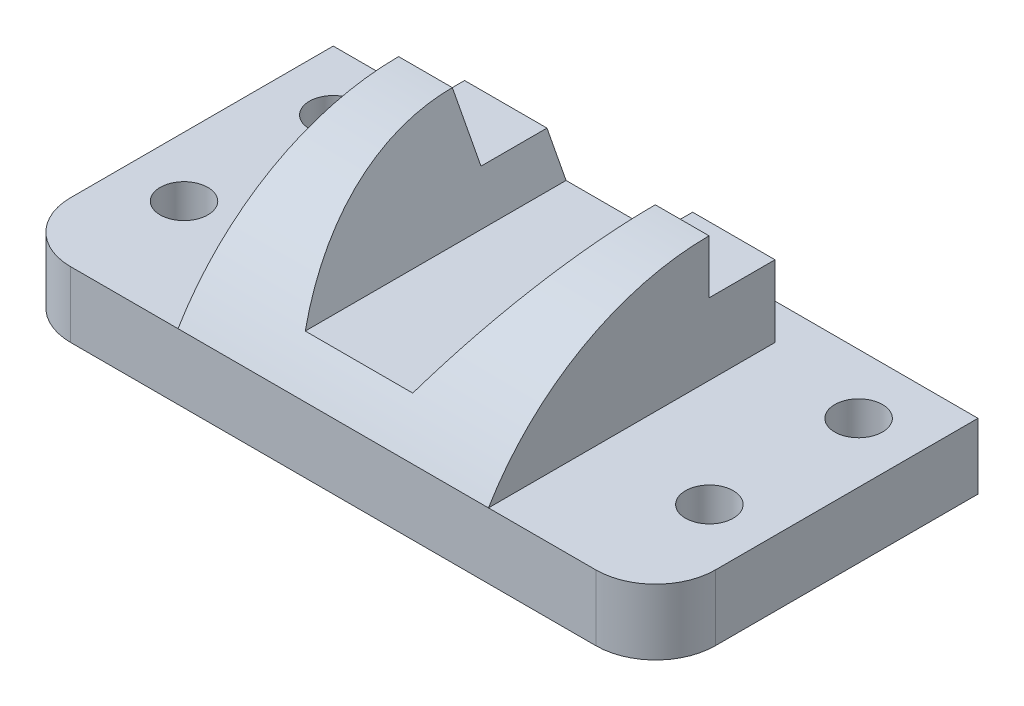
ISO-10303-21;
HEADER;
FILE_DESCRIPTION(('STEP AP214'),'2;1');
FILE_NAME('part.step','',(''),(''),'','','');
FILE_SCHEMA(('AUTOMOTIVE_DESIGN { 1 0 10303 214 1 1 1 1 }'));
ENDSEC;
DATA;
#1=APPLICATION_CONTEXT('core data for automotive mechanical design processes');
#2=APPLICATION_PROTOCOL_DEFINITION('international standard','automotive_design',2000,#1);
#3=PRODUCT_CONTEXT('',#1,'mechanical');
#4=PRODUCT('Part','Part','',(#3));
#5=PRODUCT_RELATED_PRODUCT_CATEGORY('part','',(#4));
#6=PRODUCT_DEFINITION_FORMATION('','',#4);
#7=PRODUCT_DEFINITION_CONTEXT('part definition',#1,'design');
#8=PRODUCT_DEFINITION('design','',#6,#7);
#9=PRODUCT_DEFINITION_SHAPE('','',#8);
#10=(LENGTH_UNIT() NAMED_UNIT(*) SI_UNIT(.MILLI.,.METRE.));
#11=(NAMED_UNIT(*) PLANE_ANGLE_UNIT() SI_UNIT($,.RADIAN.));
#12=(NAMED_UNIT(*) SI_UNIT($,.STERADIAN.) SOLID_ANGLE_UNIT());
#13=UNCERTAINTY_MEASURE_WITH_UNIT(LENGTH_MEASURE(1.E-05),#10,'distance_accuracy_value','');
#14=(GEOMETRIC_REPRESENTATION_CONTEXT(3) GLOBAL_UNCERTAINTY_ASSIGNED_CONTEXT((#13)) GLOBAL_UNIT_ASSIGNED_CONTEXT((#10,
#11,#12)) REPRESENTATION_CONTEXT('',''));
#15=CARTESIAN_POINT('',(0.,0.,0.));
#16=DIRECTION('',(0.,0.,1.));
#17=DIRECTION('',(1.,0.,0.));
#18=AXIS2_PLACEMENT_3D('',#15,#16,#17);
#19=CARTESIAN_POINT('',(26.,23.,-21.));
#20=DIRECTION('',(0.,0.,1.));
#21=DIRECTION('',(0.,-1.,0.));
#22=AXIS2_PLACEMENT_3D('',#19,#20,#21);
#23=PLANE('',#22);
#24=DIRECTION('',(-0.470588235294117,-0.882352941176471,0.));
#25=VECTOR('',#24,1.);
#26=CARTESIAN_POINT('',(-0.0519031141868437,0.0276816608996517,-21.));
#27=LINE('',#26,#25);
#28=CARTESIAN_POINT('',(12.2,23.,-21.));
#29=VERTEX_POINT('',#28);
#30=CARTESIAN_POINT('',(9.,17.,-21.));
#31=VERTEX_POINT('',#30);
#32=EDGE_CURVE('E341',#29,#31,#27,.T.);
#33=ORIENTED_EDGE('',*,*,#32,.F.);
#34=DIRECTION('',(-1.,0.,0.));
#35=VECTOR('',#34,1.);
#36=CARTESIAN_POINT('',(26.,23.,-21.));
#37=LINE('',#36,#35);
#38=CARTESIAN_POINT('',(26.,23.,-21.));
#39=VERTEX_POINT('',#38);
#40=EDGE_CURVE('E194',#39,#29,#37,.T.);
#41=ORIENTED_EDGE('',*,*,#40,.F.);
#42=DIRECTION('',(0.,1.,0.));
#43=VECTOR('',#42,1.);
#44=CARTESIAN_POINT('',(26.,23.,-21.));
#45=LINE('',#44,#43);
#46=CARTESIAN_POINT('',(26.,11.,-21.));
#47=VERTEX_POINT('',#46);
#48=EDGE_CURVE('E291',#47,#39,#45,.T.);
#49=ORIENTED_EDGE('',*,*,#48,.F.);
#50=DIRECTION('',(-1.,0.,0.));
#51=VECTOR('',#50,1.);
#52=CARTESIAN_POINT('',(26.,11.,-21.));
#53=LINE('',#52,#51);
#54=CARTESIAN_POINT('',(-26.,11.,-21.));
#55=VERTEX_POINT('',#54);
#56=EDGE_CURVE('E197',#47,#55,#53,.T.);
#57=ORIENTED_EDGE('',*,*,#56,.T.);
#58=DIRECTION('',(0.,1.,0.));
#59=VECTOR('',#58,1.);
#60=CARTESIAN_POINT('',(-26.,23.,-21.));
#61=LINE('',#60,#59);
#62=CARTESIAN_POINT('',(-26.,23.,-21.));
#63=VERTEX_POINT('',#62);
#64=EDGE_CURVE('E306',#55,#63,#61,.T.);
#65=ORIENTED_EDGE('',*,*,#64,.T.);
#66=CARTESIAN_POINT('',(-12.2,23.,-21.));
#67=VERTEX_POINT('',#66);
#68=EDGE_CURVE('E193',#67,#63,#37,.T.);
#69=ORIENTED_EDGE('',*,*,#68,.F.);
#70=DIRECTION('',(0.470588235294117,-0.882352941176471,0.));
#71=VECTOR('',#70,1.);
#72=CARTESIAN_POINT('',(0.0519031141868437,0.0276816608996517,-21.));
#73=LINE('',#72,#71);
#74=CARTESIAN_POINT('',(-9.,17.,-21.));
#75=VERTEX_POINT('',#74);
#76=EDGE_CURVE('E327',#67,#75,#73,.T.);
#77=ORIENTED_EDGE('',*,*,#76,.T.);
#78=DIRECTION('',(-1.,0.,0.));
#79=VECTOR('',#78,1.);
#80=CARTESIAN_POINT('',(0.,17.,-21.));
#81=LINE('',#80,#79);
#82=EDGE_CURVE('E342',#31,#75,#81,.T.);
#83=ORIENTED_EDGE('',*,*,#82,.F.);
#84=EDGE_LOOP('',(#33,#41,#49,#57,#65,#69,#77,#83));
#85=FACE_BOUND('',#84,.T.);
#86=ADVANCED_FACE('F39',(#85),#23,.F.);
#87=CARTESIAN_POINT('',(26.,23.,-9.94590640382233));
#88=DIRECTION('',(0.,-1.,0.));
#89=DIRECTION('',(0.,0.,-1.));
#90=AXIS2_PLACEMENT_3D('',#87,#88,#89);
#91=PLANE('',#90);
#92=DIRECTION('',(0.,0.,-1.));
#93=VECTOR('',#92,1.);
#94=CARTESIAN_POINT('',(12.2,23.,-27.001));
#95=LINE('',#94,#93);
#96=CARTESIAN_POINT('',(12.2,23.,-9.94590640382233));
#97=VERTEX_POINT('',#96);
#98=EDGE_CURVE('E180',#97,#29,#95,.T.);
#99=ORIENTED_EDGE('',*,*,#98,.F.);
#100=DIRECTION('',(-1.,0.,0.));
#101=VECTOR('',#100,1.);
#102=CARTESIAN_POINT('',(26.,23.,-9.94590640382233));
#103=LINE('',#102,#101);
#104=CARTESIAN_POINT('',(26.,23.,-9.94590640382233));
#105=VERTEX_POINT('',#104);
#106=EDGE_CURVE('E177',#105,#97,#103,.T.);
#107=ORIENTED_EDGE('',*,*,#106,.F.);
#108=DIRECTION('',(0.,0.,1.));
#109=VECTOR('',#108,1.);
#110=CARTESIAN_POINT('',(26.,23.,-9.94590640382233));
#111=LINE('',#110,#109);
#112=EDGE_CURVE('E293',#39,#105,#111,.T.);
#113=ORIENTED_EDGE('',*,*,#112,.F.);
#114=ORIENTED_EDGE('',*,*,#40,.T.);
#115=EDGE_LOOP('',(#99,#107,#113,#114));
#116=FACE_BOUND('',#115,.T.);
#117=ADVANCED_FACE('F354',(#116),#91,.F.);
#118=CARTESIAN_POINT('',(26.,32.,-9.94590640382233));
#119=DIRECTION('',(0.,0.,1.));
#120=DIRECTION('',(0.,-1.,0.));
#121=AXIS2_PLACEMENT_3D('',#118,#119,#120);
#122=PLANE('',#121);
#123=DIRECTION('',(-0.470588235294117,-0.882352941176471,0.));
#124=VECTOR('',#123,1.);
#125=CARTESIAN_POINT('',(-0.0519031141868458,0.0276816608996478,-9.94590640382234));
#126=LINE('',#125,#124);
#127=CARTESIAN_POINT('',(17.,32.,-9.94590640382234));
#128=VERTEX_POINT('',#127);
#129=EDGE_CURVE('E158',#128,#97,#126,.T.);
#130=ORIENTED_EDGE('',*,*,#129,.F.);
#131=DIRECTION('',(-1.,0.,0.));
#132=VECTOR('',#131,1.);
#133=CARTESIAN_POINT('',(26.,32.,-9.94590640382233));
#134=LINE('',#133,#132);
#135=CARTESIAN_POINT('',(26.,32.,-9.94590640382233));
#136=VERTEX_POINT('',#135);
#137=EDGE_CURVE('E172',#136,#128,#134,.T.);
#138=ORIENTED_EDGE('',*,*,#137,.F.);
#139=DIRECTION('',(0.,1.,0.));
#140=VECTOR('',#139,1.);
#141=CARTESIAN_POINT('',(26.,32.,-9.94590640382233));
#142=LINE('',#141,#140);
#143=EDGE_CURVE('E187',#105,#136,#142,.T.);
#144=ORIENTED_EDGE('',*,*,#143,.F.);
#145=ORIENTED_EDGE('',*,*,#106,.T.);
#146=EDGE_LOOP('',(#130,#138,#144,#145));
#147=FACE_BOUND('',#146,.T.);
#148=ADVANCED_FACE('F171',(#147),#122,.F.);
#149=CARTESIAN_POINT('',(0.,11.,0.));
#150=DIRECTION('',(0.,1.,0.));
#151=DIRECTION('',(0.,0.,1.));
#152=AXIS2_PLACEMENT_3D('',#149,#150,#151);
#153=PLANE('',#152);
#154=CARTESIAN_POINT('',(-44.,11.,-17.));
#155=DIRECTION('',(0.,1.,0.));
#156=DIRECTION('',(0.,0.,1.));
#157=AXIS2_PLACEMENT_3D('',#154,#155,#156);
#158=CIRCLE('',#157,4.00000000000001);
#159=CARTESIAN_POINT('',(-44.,11.,-13.));
#160=VERTEX_POINT('',#159);
#161=EDGE_CURVE('E209',#160,#160,#158,.T.);
#162=ORIENTED_EDGE('',*,*,#161,.F.);
#163=EDGE_LOOP('',(#162));
#164=FACE_BOUND('',#163,.T.);
#165=CARTESIAN_POINT('',(44.,11.,-17.));
#166=DIRECTION('',(0.,1.,0.));
#167=DIRECTION('',(0.,0.,-1.));
#168=AXIS2_PLACEMENT_3D('',#165,#166,#167);
#169=CIRCLE('',#168,4.00000000000001);
#170=CARTESIAN_POINT('',(44.,11.,-21.));
#171=VERTEX_POINT('',#170);
#172=EDGE_CURVE('E225',#171,#171,#169,.T.);
#173=ORIENTED_EDGE('',*,*,#172,.F.);
#174=EDGE_LOOP('',(#173));
#175=FACE_BOUND('',#174,.T.);
#176=CARTESIAN_POINT('',(-44.,11.,8.00000000000001));
#177=DIRECTION('',(0.,1.,0.));
#178=DIRECTION('',(0.,0.,1.));
#179=AXIS2_PLACEMENT_3D('',#176,#177,#178);
#180=CIRCLE('',#179,4.00000000000001);
#181=CARTESIAN_POINT('',(-44.,11.,12.));
#182=VERTEX_POINT('',#181);
#183=EDGE_CURVE('E216',#182,#182,#180,.T.);
#184=ORIENTED_EDGE('',*,*,#183,.F.);
#185=EDGE_LOOP('',(#184));
#186=FACE_BOUND('',#185,.T.);
#187=CARTESIAN_POINT('',(44.,11.,8.00000000000001));
#188=DIRECTION('',(0.,1.,0.));
#189=DIRECTION('',(0.,0.,-1.));
#190=AXIS2_PLACEMENT_3D('',#187,#188,#189);
#191=CIRCLE('',#190,4.00000000000001);
#192=CARTESIAN_POINT('',(44.,11.,4.));
#193=VERTEX_POINT('',#192);
#194=EDGE_CURVE('E204',#193,#193,#191,.T.);
#195=ORIENTED_EDGE('',*,*,#194,.F.);
#196=EDGE_LOOP('',(#195));
#197=FACE_BOUND('',#196,.T.);
#198=DIRECTION('',(0.,0.,1.));
#199=VECTOR('',#198,1.);
#200=CARTESIAN_POINT('',(-54.,11.,27.));
#201=LINE('',#200,#199);
#202=CARTESIAN_POINT('',(-54.,11.,-27.));
#203=VERTEX_POINT('',#202);
#204=CARTESIAN_POINT('',(-54.,11.,17.));
#205=VERTEX_POINT('',#204);
#206=EDGE_CURVE('E227',#203,#205,#201,.T.);
#207=ORIENTED_EDGE('',*,*,#206,.T.);
#208=CARTESIAN_POINT('',(-44.,11.,17.));
#209=DIRECTION('',(0.,1.,0.));
#210=DIRECTION('',(0.,0.,1.));
#211=AXIS2_PLACEMENT_3D('',#208,#209,#210);
#212=CIRCLE('',#211,10.);
#213=CARTESIAN_POINT('',(-44.,11.,27.));
#214=VERTEX_POINT('',#213);
#215=EDGE_CURVE('E50',#205,#214,#212,.T.);
#216=ORIENTED_EDGE('',*,*,#215,.T.);
#217=DIRECTION('',(1.,0.,0.));
#218=VECTOR('',#217,1.);
#219=CARTESIAN_POINT('',(54.,11.,27.));
#220=LINE('',#219,#218);
#221=CARTESIAN_POINT('',(-26.,11.,27.));
#222=VERTEX_POINT('',#221);
#223=EDGE_CURVE('E235',#214,#222,#220,.T.);
#224=ORIENTED_EDGE('',*,*,#223,.T.);
#225=DIRECTION('',(0.,0.,-1.));
#226=VECTOR('',#225,1.);
#227=CARTESIAN_POINT('',(-26.,11.,-21.));
#228=LINE('',#227,#226);
#229=EDGE_CURVE('E301',#222,#55,#228,.T.);
#230=ORIENTED_EDGE('',*,*,#229,.T.);
#231=ORIENTED_EDGE('',*,*,#56,.F.);
#232=DIRECTION('',(0.,0.,-1.));
#233=VECTOR('',#232,1.);
#234=CARTESIAN_POINT('',(26.,11.,-21.));
#235=LINE('',#234,#233);
#236=CARTESIAN_POINT('',(26.,11.,27.));
#237=VERTEX_POINT('',#236);
#238=EDGE_CURVE('E286',#237,#47,#235,.T.);
#239=ORIENTED_EDGE('',*,*,#238,.F.);
#240=CARTESIAN_POINT('',(44.,11.,27.));
#241=VERTEX_POINT('',#240);
#242=EDGE_CURVE('E229',#237,#241,#220,.T.);
#243=ORIENTED_EDGE('',*,*,#242,.T.);
#244=CARTESIAN_POINT('',(44.,11.,17.));
#245=DIRECTION('',(0.,1.,0.));
#246=DIRECTION('',(0.,0.,1.));
#247=AXIS2_PLACEMENT_3D('',#244,#245,#246);
#248=CIRCLE('',#247,10.);
#249=CARTESIAN_POINT('',(54.,11.,17.));
#250=VERTEX_POINT('',#249);
#251=EDGE_CURVE('E53',#241,#250,#248,.T.);
#252=ORIENTED_EDGE('',*,*,#251,.T.);
#253=DIRECTION('',(0.,0.,-1.));
#254=VECTOR('',#253,1.);
#255=CARTESIAN_POINT('',(54.,11.,27.));
#256=LINE('',#255,#254);
#257=CARTESIAN_POINT('',(54.,11.,-27.));
#258=VERTEX_POINT('',#257);
#259=EDGE_CURVE('E234',#250,#258,#256,.T.);
#260=ORIENTED_EDGE('',*,*,#259,.T.);
#261=DIRECTION('',(-1.,0.,0.));
#262=VECTOR('',#261,1.);
#263=CARTESIAN_POINT('',(54.,11.,-27.));
#264=LINE('',#263,#262);
#265=EDGE_CURVE('E237',#258,#203,#264,.T.);
#266=ORIENTED_EDGE('',*,*,#265,.T.);
#267=EDGE_LOOP('',(#207,#216,#224,#230,#231,#239,#243,#252,#260,#266));
#268=FACE_BOUND('',#267,.T.);
#269=ADVANCED_FACE('F263',(#164,#175,#186,#197,#268),#153,.T.);
#270=CARTESIAN_POINT('',(0.,0.,0.));
#271=DIRECTION('',(0.,1.,0.));
#272=DIRECTION('',(0.,0.,1.));
#273=AXIS2_PLACEMENT_3D('',#270,#271,#272);
#274=PLANE('',#273);
#275=DIRECTION('',(1.,0.,0.));
#276=VECTOR('',#275,1.);
#277=CARTESIAN_POINT('',(54.,0.,27.));
#278=LINE('',#277,#276);
#279=CARTESIAN_POINT('',(-44.,0.,27.));
#280=VERTEX_POINT('',#279);
#281=CARTESIAN_POINT('',(44.,0.,27.));
#282=VERTEX_POINT('',#281);
#283=EDGE_CURVE('E238',#280,#282,#278,.T.);
#284=ORIENTED_EDGE('',*,*,#283,.F.);
#285=CARTESIAN_POINT('',(-44.,0.,17.));
#286=DIRECTION('',(0.,1.,0.));
#287=DIRECTION('',(0.,0.,1.));
#288=AXIS2_PLACEMENT_3D('',#285,#286,#287);
#289=CIRCLE('',#288,10.);
#290=CARTESIAN_POINT('',(-54.,0.,17.));
#291=VERTEX_POINT('',#290);
#292=EDGE_CURVE('E256',#280,#291,#289,.F.);
#293=ORIENTED_EDGE('',*,*,#292,.T.);
#294=DIRECTION('',(0.,0.,1.));
#295=VECTOR('',#294,1.);
#296=CARTESIAN_POINT('',(-54.,0.,27.));
#297=LINE('',#296,#295);
#298=CARTESIAN_POINT('',(-54.,0.,-27.));
#299=VERTEX_POINT('',#298);
#300=EDGE_CURVE('E223',#299,#291,#297,.T.);
#301=ORIENTED_EDGE('',*,*,#300,.F.);
#302=DIRECTION('',(-1.,0.,0.));
#303=VECTOR('',#302,1.);
#304=CARTESIAN_POINT('',(54.,0.,-27.));
#305=LINE('',#304,#303);
#306=CARTESIAN_POINT('',(54.,0.,-27.));
#307=VERTEX_POINT('',#306);
#308=EDGE_CURVE('E232',#307,#299,#305,.T.);
#309=ORIENTED_EDGE('',*,*,#308,.F.);
#310=DIRECTION('',(0.,0.,-1.));
#311=VECTOR('',#310,1.);
#312=CARTESIAN_POINT('',(54.,0.,27.));
#313=LINE('',#312,#311);
#314=CARTESIAN_POINT('',(54.,0.,17.));
#315=VERTEX_POINT('',#314);
#316=EDGE_CURVE('E242',#315,#307,#313,.T.);
#317=ORIENTED_EDGE('',*,*,#316,.F.);
#318=CARTESIAN_POINT('',(44.,0.,17.));
#319=DIRECTION('',(0.,1.,0.));
#320=DIRECTION('',(0.,0.,1.));
#321=AXIS2_PLACEMENT_3D('',#318,#319,#320);
#322=CIRCLE('',#321,10.);
#323=EDGE_CURVE('E258',#315,#282,#322,.F.);
#324=ORIENTED_EDGE('',*,*,#323,.T.);
#325=EDGE_LOOP('',(#284,#293,#301,#309,#317,#324));
#326=FACE_BOUND('',#325,.T.);
#327=CARTESIAN_POINT('',(44.,0.,-17.));
#328=DIRECTION('',(0.,1.,0.));
#329=DIRECTION('',(0.,0.,-1.));
#330=AXIS2_PLACEMENT_3D('',#327,#328,#329);
#331=CIRCLE('',#330,4.00000000000001);
#332=CARTESIAN_POINT('',(44.,0.,-21.));
#333=VERTEX_POINT('',#332);
#334=EDGE_CURVE('E218',#333,#333,#331,.T.);
#335=ORIENTED_EDGE('',*,*,#334,.T.);
#336=EDGE_LOOP('',(#335));
#337=FACE_BOUND('',#336,.T.);
#338=CARTESIAN_POINT('',(-44.,0.,8.00000000000001));
#339=DIRECTION('',(0.,1.,0.));
#340=DIRECTION('',(0.,0.,1.));
#341=AXIS2_PLACEMENT_3D('',#338,#339,#340);
#342=CIRCLE('',#341,4.00000000000001);
#343=CARTESIAN_POINT('',(-44.,0.,12.));
#344=VERTEX_POINT('',#343);
#345=EDGE_CURVE('E213',#344,#344,#342,.T.);
#346=ORIENTED_EDGE('',*,*,#345,.T.);
#347=EDGE_LOOP('',(#346));
#348=FACE_BOUND('',#347,.T.);
#349=CARTESIAN_POINT('',(-44.,0.,-17.));
#350=DIRECTION('',(0.,1.,0.));
#351=DIRECTION('',(0.,0.,1.));
#352=AXIS2_PLACEMENT_3D('',#349,#350,#351);
#353=CIRCLE('',#352,4.00000000000001);
#354=CARTESIAN_POINT('',(-44.,0.,-13.));
#355=VERTEX_POINT('',#354);
#356=EDGE_CURVE('E210',#355,#355,#353,.T.);
#357=ORIENTED_EDGE('',*,*,#356,.T.);
#358=EDGE_LOOP('',(#357));
#359=FACE_BOUND('',#358,.T.);
#360=CARTESIAN_POINT('',(44.,0.,8.00000000000001));
#361=DIRECTION('',(0.,1.,0.));
#362=DIRECTION('',(0.,0.,-1.));
#363=AXIS2_PLACEMENT_3D('',#360,#361,#362);
#364=CIRCLE('',#363,4.00000000000001);
#365=CARTESIAN_POINT('',(44.,0.,4.));
#366=VERTEX_POINT('',#365);
#367=EDGE_CURVE('E201',#366,#366,#364,.T.);
#368=ORIENTED_EDGE('',*,*,#367,.T.);
#369=EDGE_LOOP('',(#368));
#370=FACE_BOUND('',#369,.T.);
#371=ADVANCED_FACE('F273',(#326,#337,#348,#359,#370),#274,.F.);
#372=CARTESIAN_POINT('',(-54.,11.,27.));
#373=DIRECTION('',(1.,0.,0.));
#374=DIRECTION('',(0.,0.,-1.));
#375=AXIS2_PLACEMENT_3D('',#372,#373,#374);
#376=PLANE('',#375);
#377=ORIENTED_EDGE('',*,*,#300,.T.);
#378=DIRECTION('',(0.,-1.,0.));
#379=VECTOR('',#378,1.);
#380=CARTESIAN_POINT('',(-54.,11.,17.));
#381=LINE('',#380,#379);
#382=EDGE_CURVE('E65',#291,#205,#381,.F.);
#383=ORIENTED_EDGE('',*,*,#382,.T.);
#384=ORIENTED_EDGE('',*,*,#206,.F.);
#385=DIRECTION('',(0.,-1.,0.));
#386=VECTOR('',#385,1.);
#387=CARTESIAN_POINT('',(-54.,11.,-27.));
#388=LINE('',#387,#386);
#389=EDGE_CURVE('E236',#203,#299,#388,.T.);
#390=ORIENTED_EDGE('',*,*,#389,.T.);
#391=EDGE_LOOP('',(#377,#383,#384,#390));
#392=FACE_BOUND('',#391,.T.);
#393=ADVANCED_FACE('F280',(#392),#376,.F.);
#394=CARTESIAN_POINT('',(54.,11.,27.));
#395=DIRECTION('',(0.,0.,-1.));
#396=DIRECTION('',(-1.,0.,0.));
#397=AXIS2_PLACEMENT_3D('',#394,#395,#396);
#398=PLANE('',#397);
#399=ORIENTED_EDGE('',*,*,#223,.F.);
#400=DIRECTION('',(0.,-1.,0.));
#401=VECTOR('',#400,1.);
#402=CARTESIAN_POINT('',(-44.,11.,27.));
#403=LINE('',#402,#401);
#404=EDGE_CURVE('E251',#214,#280,#403,.T.);
#405=ORIENTED_EDGE('',*,*,#404,.T.);
#406=ORIENTED_EDGE('',*,*,#283,.T.);
#407=DIRECTION('',(0.,-1.,0.));
#408=VECTOR('',#407,1.);
#409=CARTESIAN_POINT('',(44.,11.,27.));
#410=LINE('',#409,#408);
#411=EDGE_CURVE('E253',#282,#241,#410,.F.);
#412=ORIENTED_EDGE('',*,*,#411,.T.);
#413=ORIENTED_EDGE('',*,*,#242,.F.);
#414=DIRECTION('',(-1.,0.,0.));
#415=VECTOR('',#414,1.);
#416=CARTESIAN_POINT('',(26.,11.,27.));
#417=LINE('',#416,#415);
#418=EDGE_CURVE('E199',#237,#222,#417,.T.);
#419=ORIENTED_EDGE('',*,*,#418,.T.);
#420=EDGE_LOOP('',(#399,#405,#406,#412,#413,#419));
#421=FACE_BOUND('',#420,.T.);
#422=ADVANCED_FACE('F270',(#421),#398,.F.);
#423=CARTESIAN_POINT('',(54.,11.,27.));
#424=DIRECTION('',(-1.,0.,0.));
#425=DIRECTION('',(0.,0.,1.));
#426=AXIS2_PLACEMENT_3D('',#423,#424,#425);
#427=PLANE('',#426);
#428=ORIENTED_EDGE('',*,*,#259,.F.);
#429=DIRECTION('',(0.,-1.,0.));
#430=VECTOR('',#429,1.);
#431=CARTESIAN_POINT('',(54.,11.,17.));
#432=LINE('',#431,#430);
#433=EDGE_CURVE('E11',#250,#315,#432,.T.);
#434=ORIENTED_EDGE('',*,*,#433,.T.);
#435=ORIENTED_EDGE('',*,*,#316,.T.);
#436=DIRECTION('',(0.,-1.,0.));
#437=VECTOR('',#436,1.);
#438=CARTESIAN_POINT('',(54.,11.,-27.));
#439=LINE('',#438,#437);
#440=EDGE_CURVE('E248',#258,#307,#439,.T.);
#441=ORIENTED_EDGE('',*,*,#440,.F.);
#442=EDGE_LOOP('',(#428,#434,#435,#441));
#443=FACE_BOUND('',#442,.T.);
#444=ADVANCED_FACE('F284',(#443),#427,.F.);
#445=CARTESIAN_POINT('',(54.,11.,-27.));
#446=DIRECTION('',(0.,0.,1.));
#447=DIRECTION('',(1.,0.,0.));
#448=AXIS2_PLACEMENT_3D('',#445,#446,#447);
#449=PLANE('',#448);
#450=ORIENTED_EDGE('',*,*,#308,.T.);
#451=ORIENTED_EDGE('',*,*,#389,.F.);
#452=ORIENTED_EDGE('',*,*,#265,.F.);
#453=ORIENTED_EDGE('',*,*,#440,.T.);
#454=EDGE_LOOP('',(#450,#451,#452,#453));
#455=FACE_BOUND('',#454,.T.);
#456=ADVANCED_FACE('F281',(#455),#449,.F.);
#457=CARTESIAN_POINT('',(44.,11.,-17.));
#458=DIRECTION('',(0.,-1.,0.));
#459=DIRECTION('',(0.,0.,-1.));
#460=AXIS2_PLACEMENT_3D('',#457,#458,#459);
#461=CYLINDRICAL_SURFACE('',#460,4.00000000000001);
#462=ORIENTED_EDGE('',*,*,#172,.T.);
#463=EDGE_LOOP('',(#462));
#464=FACE_BOUND('',#463,.T.);
#465=ORIENTED_EDGE('',*,*,#334,.F.);
#466=EDGE_LOOP('',(#465));
#467=FACE_BOUND('',#466,.T.);
#468=ADVANCED_FACE('F387',(#464,#467),#461,.F.);
#469=CARTESIAN_POINT('',(-44.,11.,8.00000000000001));
#470=DIRECTION('',(0.,-1.,0.));
#471=DIRECTION('',(0.,0.,-1.));
#472=AXIS2_PLACEMENT_3D('',#469,#470,#471);
#473=CYLINDRICAL_SURFACE('',#472,4.00000000000001);
#474=ORIENTED_EDGE('',*,*,#183,.T.);
#475=EDGE_LOOP('',(#474));
#476=FACE_BOUND('',#475,.T.);
#477=ORIENTED_EDGE('',*,*,#345,.F.);
#478=EDGE_LOOP('',(#477));
#479=FACE_BOUND('',#478,.T.);
#480=ADVANCED_FACE('F385',(#476,#479),#473,.F.);
#481=CARTESIAN_POINT('',(-44.,11.,-17.));
#482=DIRECTION('',(0.,-1.,0.));
#483=DIRECTION('',(0.,0.,-1.));
#484=AXIS2_PLACEMENT_3D('',#481,#482,#483);
#485=CYLINDRICAL_SURFACE('',#484,4.00000000000001);
#486=ORIENTED_EDGE('',*,*,#161,.T.);
#487=EDGE_LOOP('',(#486));
#488=FACE_BOUND('',#487,.T.);
#489=ORIENTED_EDGE('',*,*,#356,.F.);
#490=EDGE_LOOP('',(#489));
#491=FACE_BOUND('',#490,.T.);
#492=ADVANCED_FACE('F378',(#488,#491),#485,.F.);
#493=CARTESIAN_POINT('',(44.,11.,8.00000000000001));
#494=DIRECTION('',(0.,-1.,0.));
#495=DIRECTION('',(0.,0.,-1.));
#496=AXIS2_PLACEMENT_3D('',#493,#494,#495);
#497=CYLINDRICAL_SURFACE('',#496,4.00000000000001);
#498=ORIENTED_EDGE('',*,*,#194,.T.);
#499=EDGE_LOOP('',(#498));
#500=FACE_BOUND('',#499,.T.);
#501=ORIENTED_EDGE('',*,*,#367,.F.);
#502=EDGE_LOOP('',(#501));
#503=FACE_BOUND('',#502,.T.);
#504=ADVANCED_FACE('F376',(#500,#503),#497,.F.);
#505=CARTESIAN_POINT('',(26.,-11.,-9.94590640382234));
#506=DIRECTION('',(-1.,0.,0.));
#507=DIRECTION('',(0.,0.,1.));
#508=AXIS2_PLACEMENT_3D('',#505,#506,#507);
#509=CYLINDRICAL_SURFACE('',#508,43.);
#510=ORIENTED_EDGE('',*,*,#137,.T.);
#511=CARTESIAN_POINT('',(-5.93333333333331,-11.,-9.94590640382234));
#512=DIRECTION('',(-0.882352941176471,0.470588235294117,0.));
#513=DIRECTION('',(-0.470588235294117,-0.882352941176471,0.));
#514=AXIS2_PLACEMENT_3D('',#511,#512,#513);
#515=ELLIPSE('',#514,48.7333333333333,43.);
#516=CARTESIAN_POINT('',(9.,17.,22.6884313403391));
#517=VERTEX_POINT('',#516);
#518=EDGE_CURVE('E154',#128,#517,#515,.F.);
#519=ORIENTED_EDGE('',*,*,#518,.T.);
#520=DIRECTION('',(-1.,0.,0.));
#521=VECTOR('',#520,1.);
#522=CARTESIAN_POINT('',(26.,17.,22.6884313403391));
#523=LINE('',#522,#521);
#524=CARTESIAN_POINT('',(-9.,17.,22.6884313403391));
#525=VERTEX_POINT('',#524);
#526=EDGE_CURVE('E164',#517,#525,#523,.T.);
#527=ORIENTED_EDGE('',*,*,#526,.T.);
#528=CARTESIAN_POINT('',(5.93333333333331,-11.,-9.94590640382234));
#529=DIRECTION('',(-0.882352941176471,-0.470588235294117,0.));
#530=DIRECTION('',(-0.470588235294117,0.882352941176471,0.));
#531=AXIS2_PLACEMENT_3D('',#528,#529,#530);
#532=ELLIPSE('',#531,48.7333333333333,43.);
#533=CARTESIAN_POINT('',(-17.,32.,-9.94590640382234));
#534=VERTEX_POINT('',#533);
#535=EDGE_CURVE('E167',#534,#525,#532,.F.);
#536=ORIENTED_EDGE('',*,*,#535,.F.);
#537=CARTESIAN_POINT('',(-26.,32.,-9.94590640382233));
#538=VERTEX_POINT('',#537);
#539=EDGE_CURVE('E183',#534,#538,#134,.T.);
#540=ORIENTED_EDGE('',*,*,#539,.T.);
#541=CARTESIAN_POINT('',(-26.,-11.,-9.94590640382234));
#542=DIRECTION('',(1.,0.,0.));
#543=DIRECTION('',(0.,0.,1.));
#544=AXIS2_PLACEMENT_3D('',#541,#542,#543);
#545=CIRCLE('',#544,43.);
#546=EDGE_CURVE('E305',#538,#222,#545,.T.);
#547=ORIENTED_EDGE('',*,*,#546,.T.);
#548=ORIENTED_EDGE('',*,*,#418,.F.);
#549=CARTESIAN_POINT('',(26.,-11.,-9.94590640382234));
#550=DIRECTION('',(1.,0.,0.));
#551=DIRECTION('',(0.,0.,1.));
#552=AXIS2_PLACEMENT_3D('',#549,#550,#551);
#553=CIRCLE('',#552,43.);
#554=EDGE_CURVE('E181',#136,#237,#553,.T.);
#555=ORIENTED_EDGE('',*,*,#554,.F.);
#556=EDGE_LOOP('',(#510,#519,#527,#536,#540,#547,#548,#555));
#557=FACE_BOUND('',#556,.T.);
#558=ADVANCED_FACE('F176',(#557),#509,.T.);
#559=CARTESIAN_POINT('',(-12.2,23.,-9.94590640382233));
#560=VERTEX_POINT('',#559);
#561=CARTESIAN_POINT('',(-26.,23.,-9.94590640382233));
#562=VERTEX_POINT('',#561);
#563=EDGE_CURVE('E184',#560,#562,#103,.T.);
#564=ORIENTED_EDGE('',*,*,#563,.F.);
#565=DIRECTION('',(0.,0.,-1.));
#566=VECTOR('',#565,1.);
#567=CARTESIAN_POINT('',(-12.2,23.,-27.001));
#568=LINE('',#567,#566);
#569=EDGE_CURVE('E332',#560,#67,#568,.T.);
#570=ORIENTED_EDGE('',*,*,#569,.T.);
#571=ORIENTED_EDGE('',*,*,#68,.T.);
#572=DIRECTION('',(0.,0.,1.));
#573=VECTOR('',#572,1.);
#574=CARTESIAN_POINT('',(-26.,23.,-9.94590640382233));
#575=LINE('',#574,#573);
#576=EDGE_CURVE('E309',#63,#562,#575,.T.);
#577=ORIENTED_EDGE('',*,*,#576,.T.);
#578=EDGE_LOOP('',(#564,#570,#571,#577));
#579=FACE_BOUND('',#578,.T.);
#580=ADVANCED_FACE('F346',(#579),#91,.F.);
#581=ORIENTED_EDGE('',*,*,#539,.F.);
#582=DIRECTION('',(0.470588235294117,-0.882352941176471,0.));
#583=VECTOR('',#582,1.);
#584=CARTESIAN_POINT('',(0.0519031141868458,0.0276816608996478,-9.94590640382234));
#585=LINE('',#584,#583);
#586=EDGE_CURVE('E178',#534,#560,#585,.T.);
#587=ORIENTED_EDGE('',*,*,#586,.T.);
#588=ORIENTED_EDGE('',*,*,#563,.T.);
#589=DIRECTION('',(0.,1.,0.));
#590=VECTOR('',#589,1.);
#591=CARTESIAN_POINT('',(-26.,32.,-9.94590640382233));
#592=LINE('',#591,#590);
#593=EDGE_CURVE('E189',#562,#538,#592,.T.);
#594=ORIENTED_EDGE('',*,*,#593,.T.);
#595=EDGE_LOOP('',(#581,#587,#588,#594));
#596=FACE_BOUND('',#595,.T.);
#597=ADVANCED_FACE('F319',(#596),#122,.F.);
#598=CARTESIAN_POINT('',(26.,-11.,-9.94590640382234));
#599=DIRECTION('',(-1.,0.,0.));
#600=DIRECTION('',(0.,0.,1.));
#601=AXIS2_PLACEMENT_3D('',#598,#599,#600);
#602=PLANE('',#601);
#603=ORIENTED_EDGE('',*,*,#554,.T.);
#604=ORIENTED_EDGE('',*,*,#238,.T.);
#605=ORIENTED_EDGE('',*,*,#48,.T.);
#606=ORIENTED_EDGE('',*,*,#112,.T.);
#607=ORIENTED_EDGE('',*,*,#143,.T.);
#608=EDGE_LOOP('',(#603,#604,#605,#606,#607));
#609=FACE_BOUND('',#608,.T.);
#610=ADVANCED_FACE('F357',(#609),#602,.F.);
#611=CARTESIAN_POINT('',(-26.,-11.,-9.94590640382234));
#612=DIRECTION('',(-1.,0.,0.));
#613=DIRECTION('',(0.,0.,1.));
#614=AXIS2_PLACEMENT_3D('',#611,#612,#613);
#615=PLANE('',#614);
#616=ORIENTED_EDGE('',*,*,#546,.F.);
#617=ORIENTED_EDGE('',*,*,#593,.F.);
#618=ORIENTED_EDGE('',*,*,#576,.F.);
#619=ORIENTED_EDGE('',*,*,#64,.F.);
#620=ORIENTED_EDGE('',*,*,#229,.F.);
#621=EDGE_LOOP('',(#616,#617,#618,#619,#620));
#622=FACE_BOUND('',#621,.T.);
#623=ADVANCED_FACE('F323',(#622),#615,.T.);
#624=CARTESIAN_POINT('',(-0.0519031141868444,0.0276816608996503,27.001));
#625=DIRECTION('',(-0.882352941176471,0.470588235294117,0.));
#626=DIRECTION('',(-0.470588235294117,-0.882352941176471,0.));
#627=AXIS2_PLACEMENT_3D('',#624,#625,#626);
#628=PLANE('',#627);
#629=DIRECTION('',(0.,0.,-1.));
#630=VECTOR('',#629,1.);
#631=CARTESIAN_POINT('',(9.,17.,27.001));
#632=LINE('',#631,#630);
#633=EDGE_CURVE('E161',#517,#31,#632,.T.);
#634=ORIENTED_EDGE('',*,*,#633,.F.);
#635=ORIENTED_EDGE('',*,*,#518,.F.);
#636=ORIENTED_EDGE('',*,*,#129,.T.);
#637=ORIENTED_EDGE('',*,*,#98,.T.);
#638=ORIENTED_EDGE('',*,*,#32,.T.);
#639=EDGE_LOOP('',(#634,#635,#636,#637,#638));
#640=FACE_BOUND('',#639,.T.);
#641=ADVANCED_FACE('F160',(#640),#628,.T.);
#642=CARTESIAN_POINT('',(0.0519031141868444,0.0276816608996503,27.001));
#643=DIRECTION('',(-0.882352941176471,-0.470588235294117,0.));
#644=DIRECTION('',(0.470588235294117,-0.882352941176471,0.));
#645=AXIS2_PLACEMENT_3D('',#642,#643,#644);
#646=PLANE('',#645);
#647=ORIENTED_EDGE('',*,*,#535,.T.);
#648=DIRECTION('',(0.,0.,-1.));
#649=VECTOR('',#648,1.);
#650=CARTESIAN_POINT('',(-9.,17.,27.001));
#651=LINE('',#650,#649);
#652=EDGE_CURVE('E308',#525,#75,#651,.T.);
#653=ORIENTED_EDGE('',*,*,#652,.T.);
#654=ORIENTED_EDGE('',*,*,#76,.F.);
#655=ORIENTED_EDGE('',*,*,#569,.F.);
#656=ORIENTED_EDGE('',*,*,#586,.F.);
#657=EDGE_LOOP('',(#647,#653,#654,#655,#656));
#658=FACE_BOUND('',#657,.T.);
#659=ADVANCED_FACE('F340',(#658),#646,.F.);
#660=CARTESIAN_POINT('',(0.,17.,27.001));
#661=DIRECTION('',(0.,1.,0.));
#662=DIRECTION('',(0.,0.,1.));
#663=AXIS2_PLACEMENT_3D('',#660,#661,#662);
#664=PLANE('',#663);
#665=ORIENTED_EDGE('',*,*,#633,.T.);
#666=ORIENTED_EDGE('',*,*,#82,.T.);
#667=ORIENTED_EDGE('',*,*,#652,.F.);
#668=ORIENTED_EDGE('',*,*,#526,.F.);
#669=EDGE_LOOP('',(#665,#666,#667,#668));
#670=FACE_BOUND('',#669,.T.);
#671=ADVANCED_FACE('F345',(#670),#664,.T.);
#672=CARTESIAN_POINT('',(-44.,11.,17.));
#673=DIRECTION('',(0.,-1.,0.));
#674=DIRECTION('',(0.,0.,-1.));
#675=AXIS2_PLACEMENT_3D('',#672,#673,#674);
#676=CYLINDRICAL_SURFACE('',#675,10.);
#677=ORIENTED_EDGE('',*,*,#215,.F.);
#678=ORIENTED_EDGE('',*,*,#382,.F.);
#679=ORIENTED_EDGE('',*,*,#292,.F.);
#680=ORIENTED_EDGE('',*,*,#404,.F.);
#681=EDGE_LOOP('',(#677,#678,#679,#680));
#682=FACE_BOUND('',#681,.T.);
#683=ADVANCED_FACE('F271',(#682),#676,.T.);
#684=CARTESIAN_POINT('',(44.,11.,17.));
#685=DIRECTION('',(0.,-1.,0.));
#686=DIRECTION('',(0.,0.,-1.));
#687=AXIS2_PLACEMENT_3D('',#684,#685,#686);
#688=CYLINDRICAL_SURFACE('',#687,10.);
#689=ORIENTED_EDGE('',*,*,#251,.F.);
#690=ORIENTED_EDGE('',*,*,#411,.F.);
#691=ORIENTED_EDGE('',*,*,#323,.F.);
#692=ORIENTED_EDGE('',*,*,#433,.F.);
#693=EDGE_LOOP('',(#689,#690,#691,#692));
#694=FACE_BOUND('',#693,.T.);
#695=ADVANCED_FACE('F41',(#694),#688,.T.);
#696=CLOSED_SHELL('',(#86,#117,#148,#269,#371,#393,#422,#444,#456,#468,#480,#492,#504,#558,#580,
#597,#610,#623,#641,#659,#671,#683,#695));
#697=MANIFOLD_SOLID_BREP('B2',#696);
#698=ADVANCED_BREP_SHAPE_REPRESENTATION('',(#18,#697),#14);
#699=SHAPE_DEFINITION_REPRESENTATION(#9,#698);
ENDSEC;
END-ISO-10303-21;
